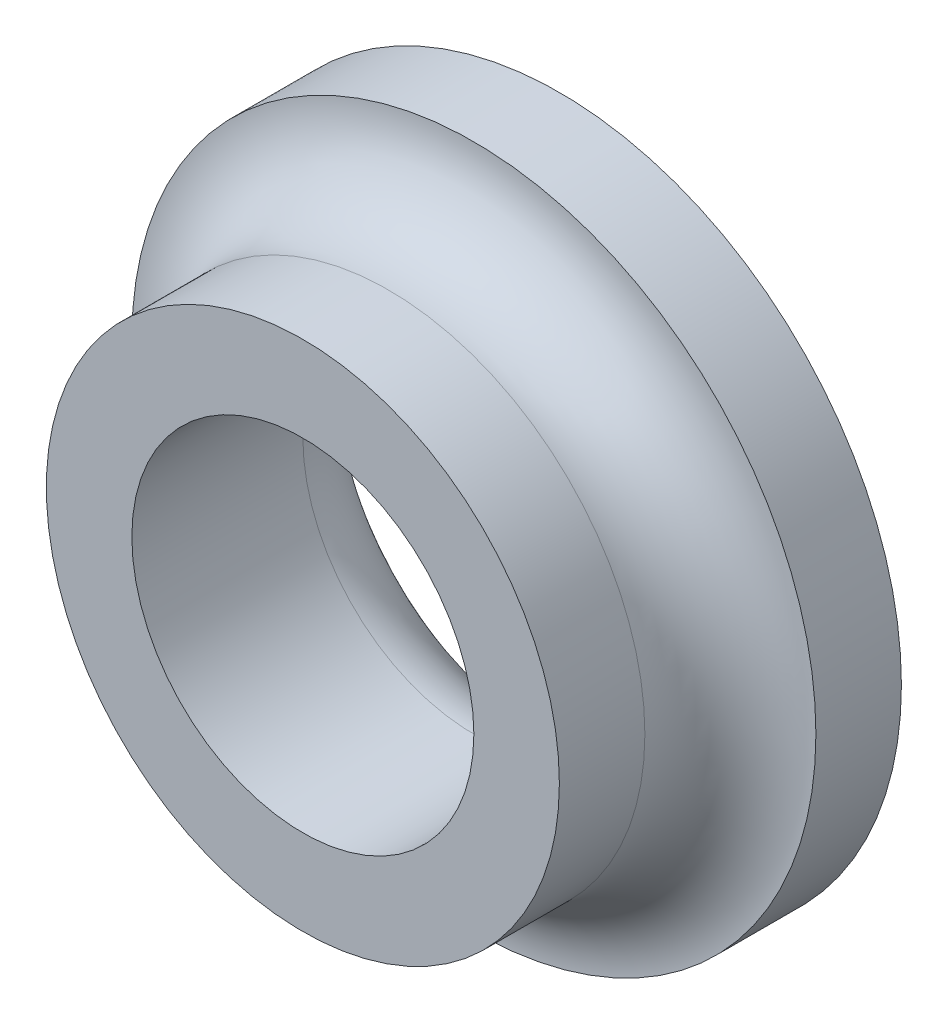
ISO-10303-21;
HEADER;
FILE_DESCRIPTION(('STEP AP214'),'2;1');
FILE_NAME('part.step','',(''),(''),'','','');
FILE_SCHEMA(('AUTOMOTIVE_DESIGN { 1 0 10303 214 1 1 1 1 }'));
ENDSEC;
DATA;
#1=APPLICATION_CONTEXT('core data for automotive mechanical design processes');
#2=APPLICATION_PROTOCOL_DEFINITION('international standard','automotive_design',2000,#1);
#3=PRODUCT_CONTEXT('',#1,'mechanical');
#4=PRODUCT('Part','Part','',(#3));
#5=PRODUCT_RELATED_PRODUCT_CATEGORY('part','',(#4));
#6=PRODUCT_DEFINITION_FORMATION('','',#4);
#7=PRODUCT_DEFINITION_CONTEXT('part definition',#1,'design');
#8=PRODUCT_DEFINITION('design','',#6,#7);
#9=PRODUCT_DEFINITION_SHAPE('','',#8);
#10=(LENGTH_UNIT() NAMED_UNIT(*) SI_UNIT(.MILLI.,.METRE.));
#11=(NAMED_UNIT(*) PLANE_ANGLE_UNIT() SI_UNIT($,.RADIAN.));
#12=(NAMED_UNIT(*) SI_UNIT($,.STERADIAN.) SOLID_ANGLE_UNIT());
#13=UNCERTAINTY_MEASURE_WITH_UNIT(LENGTH_MEASURE(1.E-05),#10,'distance_accuracy_value','');
#14=(GEOMETRIC_REPRESENTATION_CONTEXT(3) GLOBAL_UNCERTAINTY_ASSIGNED_CONTEXT((#13)) GLOBAL_UNIT_ASSIGNED_CONTEXT((#10,
#11,#12)) REPRESENTATION_CONTEXT('',''));
#15=CARTESIAN_POINT('',(0.,0.,0.));
#16=DIRECTION('',(0.,0.,1.));
#17=DIRECTION('',(1.,0.,0.));
#18=AXIS2_PLACEMENT_3D('',#15,#16,#17);
#19=CARTESIAN_POINT('',(0.,0.,1.));
#20=DIRECTION('',(0.,0.,-1.));
#21=DIRECTION('',(-1.,0.,0.));
#22=AXIS2_PLACEMENT_3D('',#19,#20,#21);
#23=CYLINDRICAL_SURFACE('',#22,4.);
#24=CARTESIAN_POINT('',(0.,0.,1.));
#25=DIRECTION('',(0.,0.,1.));
#26=DIRECTION('',(1.,0.,0.));
#27=AXIS2_PLACEMENT_3D('',#24,#25,#26);
#28=CIRCLE('',#27,4.);
#29=CARTESIAN_POINT('',(4.,0.,1.));
#30=VERTEX_POINT('',#29);
#31=EDGE_CURVE('E49',#30,#30,#28,.T.);
#32=ORIENTED_EDGE('',*,*,#31,.F.);
#33=EDGE_LOOP('',(#32));
#34=FACE_BOUND('',#33,.T.);
#35=CARTESIAN_POINT('',(0.,0.,0.));
#36=DIRECTION('',(0.,0.,1.));
#37=DIRECTION('',(1.,0.,0.));
#38=AXIS2_PLACEMENT_3D('',#35,#36,#37);
#39=CIRCLE('',#38,4.);
#40=CARTESIAN_POINT('',(4.,0.,0.));
#41=VERTEX_POINT('',#40);
#42=EDGE_CURVE('E52',#41,#41,#39,.T.);
#43=ORIENTED_EDGE('',*,*,#42,.T.);
#44=EDGE_LOOP('',(#43));
#45=FACE_BOUND('',#44,.T.);
#46=ADVANCED_FACE('F34',(#34,#45),#23,.T.);
#47=CARTESIAN_POINT('',(0.,0.,0.));
#48=DIRECTION('',(0.,0.,1.));
#49=DIRECTION('',(1.,0.,0.));
#50=AXIS2_PLACEMENT_3D('',#47,#48,#49);
#51=PLANE('',#50);
#52=CARTESIAN_POINT('',(0.,0.,0.));
#53=DIRECTION('',(0.,0.,1.));
#54=DIRECTION('',(1.,0.,0.));
#55=AXIS2_PLACEMENT_3D('',#52,#53,#54);
#56=CIRCLE('',#55,3.);
#57=CARTESIAN_POINT('',(3.,0.,0.));
#58=VERTEX_POINT('',#57);
#59=EDGE_CURVE('E41',#58,#58,#56,.T.);
#60=ORIENTED_EDGE('',*,*,#59,.T.);
#61=EDGE_LOOP('',(#60));
#62=FACE_BOUND('',#61,.T.);
#63=ORIENTED_EDGE('',*,*,#42,.F.);
#64=EDGE_LOOP('',(#63));
#65=FACE_BOUND('',#64,.T.);
#66=ADVANCED_FACE('F75',(#62,#65),#51,.F.);
#67=CARTESIAN_POINT('',(0.,0.,3.));
#68=DIRECTION('',(0.,0.,-1.));
#69=DIRECTION('',(-1.,0.,0.));
#70=AXIS2_PLACEMENT_3D('',#67,#68,#69);
#71=CYLINDRICAL_SURFACE('',#70,3.);
#72=CARTESIAN_POINT('',(0.,0.,2.));
#73=DIRECTION('',(0.,0.,1.));
#74=DIRECTION('',(1.,0.,0.));
#75=AXIS2_PLACEMENT_3D('',#72,#73,#74);
#76=CIRCLE('',#75,3.);
#77=CARTESIAN_POINT('',(3.,0.,2.));
#78=VERTEX_POINT('',#77);
#79=EDGE_CURVE('E45',#78,#78,#76,.T.);
#80=ORIENTED_EDGE('',*,*,#79,.T.);
#81=EDGE_LOOP('',(#80));
#82=FACE_BOUND('',#81,.T.);
#83=CARTESIAN_POINT('',(0.,0.,3.));
#84=DIRECTION('',(0.,0.,1.));
#85=DIRECTION('',(1.,0.,0.));
#86=AXIS2_PLACEMENT_3D('',#83,#84,#85);
#87=CIRCLE('',#86,3.);
#88=CARTESIAN_POINT('',(3.,0.,3.));
#89=VERTEX_POINT('',#88);
#90=EDGE_CURVE('E55',#89,#89,#87,.T.);
#91=ORIENTED_EDGE('',*,*,#90,.F.);
#92=EDGE_LOOP('',(#91));
#93=FACE_BOUND('',#92,.T.);
#94=ADVANCED_FACE('F70',(#82,#93),#71,.T.);
#95=CARTESIAN_POINT('',(0.,0.,3.));
#96=DIRECTION('',(0.,0.,1.));
#97=DIRECTION('',(1.,0.,0.));
#98=AXIS2_PLACEMENT_3D('',#95,#96,#97);
#99=PLANE('',#98);
#100=CARTESIAN_POINT('',(0.,0.,3.));
#101=DIRECTION('',(0.,0.,1.));
#102=DIRECTION('',(1.,0.,0.));
#103=AXIS2_PLACEMENT_3D('',#100,#101,#102);
#104=CIRCLE('',#103,2.);
#105=CARTESIAN_POINT('',(2.,0.,3.));
#106=VERTEX_POINT('',#105);
#107=EDGE_CURVE('E60',#106,#106,#104,.T.);
#108=ORIENTED_EDGE('',*,*,#107,.F.);
#109=EDGE_LOOP('',(#108));
#110=FACE_BOUND('',#109,.T.);
#111=ORIENTED_EDGE('',*,*,#90,.T.);
#112=EDGE_LOOP('',(#111));
#113=FACE_BOUND('',#112,.T.);
#114=ADVANCED_FACE('F66',(#110,#113),#99,.T.);
#115=CARTESIAN_POINT('',(0.,0.,2.));
#116=DIRECTION('',(0.,0.,1.));
#117=DIRECTION('',(1.,0.,0.));
#118=AXIS2_PLACEMENT_3D('',#115,#116,#117);
#119=TOROIDAL_SURFACE('',#118,4.,1.);
#120=ORIENTED_EDGE('',*,*,#31,.T.);
#121=EDGE_LOOP('',(#120));
#122=FACE_BOUND('',#121,.T.);
#123=ORIENTED_EDGE('',*,*,#79,.F.);
#124=EDGE_LOOP('',(#123));
#125=FACE_BOUND('',#124,.T.);
#126=ADVANCED_FACE('F69',(#122,#125),#119,.F.);
#127=CARTESIAN_POINT('',(0.,0.,-1.));
#128=DIRECTION('',(0.,0.,1.));
#129=DIRECTION('',(1.,0.,0.));
#130=AXIS2_PLACEMENT_3D('',#127,#128,#129);
#131=CYLINDRICAL_SURFACE('',#130,2.);
#132=CARTESIAN_POINT('',(0.,0.,1.));
#133=DIRECTION('',(0.,0.,1.));
#134=DIRECTION('',(1.,0.,0.));
#135=AXIS2_PLACEMENT_3D('',#132,#133,#134);
#136=CIRCLE('',#135,2.);
#137=CARTESIAN_POINT('',(2.,0.,1.));
#138=VERTEX_POINT('',#137);
#139=EDGE_CURVE('E10',#138,#138,#136,.F.);
#140=ORIENTED_EDGE('',*,*,#139,.T.);
#141=EDGE_LOOP('',(#140));
#142=FACE_BOUND('',#141,.T.);
#143=ORIENTED_EDGE('',*,*,#107,.T.);
#144=EDGE_LOOP('',(#143));
#145=FACE_BOUND('',#144,.T.);
#146=ADVANCED_FACE('F64',(#142,#145),#131,.F.);
#147=CARTESIAN_POINT('',(0.,0.,1.));
#148=DIRECTION('',(0.,0.,1.));
#149=DIRECTION('',(1.,0.,0.));
#150=AXIS2_PLACEMENT_3D('',#147,#148,#149);
#151=TOROIDAL_SURFACE('',#150,3.,1.);
#152=ORIENTED_EDGE('',*,*,#139,.F.);
#153=EDGE_LOOP('',(#152));
#154=FACE_BOUND('',#153,.T.);
#155=ORIENTED_EDGE('',*,*,#59,.F.);
#156=EDGE_LOOP('',(#155));
#157=FACE_BOUND('',#156,.T.);
#158=ADVANCED_FACE('F36',(#154,#157),#151,.T.);
#159=CLOSED_SHELL('',(#46,#66,#94,#114,#126,#146,#158));
#160=MANIFOLD_SOLID_BREP('B2',#159);
#161=ADVANCED_BREP_SHAPE_REPRESENTATION('',(#18,#160),#14);
#162=SHAPE_DEFINITION_REPRESENTATION(#9,#161);
ENDSEC;
END-ISO-10303-21;
